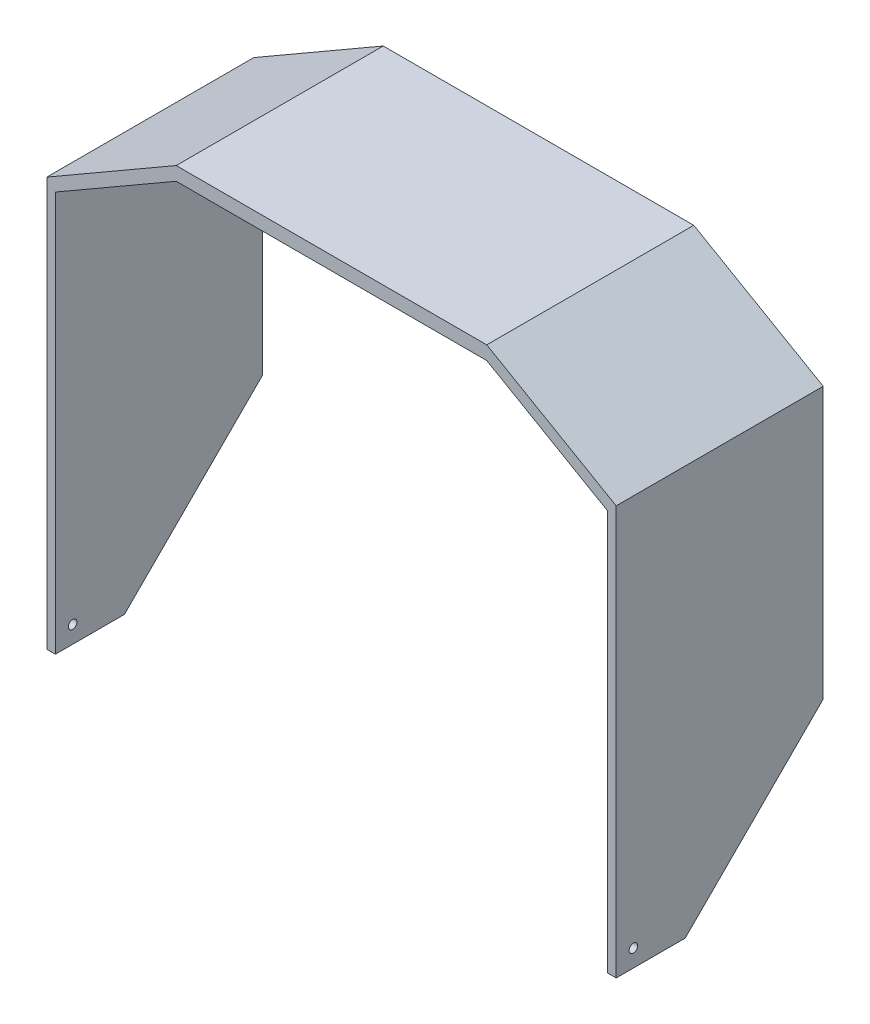
ISO-10303-21;
HEADER;
FILE_DESCRIPTION(('STEP AP214'),'2;1');
FILE_NAME('part.step','',(''),(''),'','','');
FILE_SCHEMA(('AUTOMOTIVE_DESIGN { 1 0 10303 214 1 1 1 1 }'));
ENDSEC;
DATA;
#1=APPLICATION_CONTEXT('core data for automotive mechanical design processes');
#2=APPLICATION_PROTOCOL_DEFINITION('international standard','automotive_design',2000,#1);
#3=PRODUCT_CONTEXT('',#1,'mechanical');
#4=PRODUCT('Part','Part','',(#3));
#5=PRODUCT_RELATED_PRODUCT_CATEGORY('part','',(#4));
#6=PRODUCT_DEFINITION_FORMATION('','',#4);
#7=PRODUCT_DEFINITION_CONTEXT('part definition',#1,'design');
#8=PRODUCT_DEFINITION('design','',#6,#7);
#9=PRODUCT_DEFINITION_SHAPE('','',#8);
#10=(LENGTH_UNIT() NAMED_UNIT(*) SI_UNIT(.MILLI.,.METRE.));
#11=(NAMED_UNIT(*) PLANE_ANGLE_UNIT() SI_UNIT($,.RADIAN.));
#12=(NAMED_UNIT(*) SI_UNIT($,.STERADIAN.) SOLID_ANGLE_UNIT());
#13=UNCERTAINTY_MEASURE_WITH_UNIT(LENGTH_MEASURE(1.E-05),#10,'distance_accuracy_value','');
#14=(GEOMETRIC_REPRESENTATION_CONTEXT(3) GLOBAL_UNCERTAINTY_ASSIGNED_CONTEXT((#13)) GLOBAL_UNIT_ASSIGNED_CONTEXT((#10,
#11,#12)) REPRESENTATION_CONTEXT('',''));
#15=CARTESIAN_POINT('',(0.,0.,0.));
#16=DIRECTION('',(0.,0.,1.));
#17=DIRECTION('',(1.,0.,0.));
#18=AXIS2_PLACEMENT_3D('',#15,#16,#17);
#19=CARTESIAN_POINT('',(0.,0.,120.));
#20=DIRECTION('',(-0.499999999999992,0.866025403784443,0.));
#21=DIRECTION('',(-0.866025403784443,-0.499999999999992,0.));
#22=AXIS2_PLACEMENT_3D('',#19,#20,#21);
#23=PLANE('',#22);
#24=DIRECTION('',(0.866025403784443,0.499999999999992,0.));
#25=VECTOR('',#24,1.);
#26=CARTESIAN_POINT('',(0.,0.,0.));
#27=LINE('',#26,#25);
#28=CARTESIAN_POINT('',(0.,0.,0.));
#29=VERTEX_POINT('',#28);
#30=CARTESIAN_POINT('',(70.0000000000003,40.4145188432731,0.));
#31=VERTEX_POINT('',#30);
#32=EDGE_CURVE('E218',#29,#31,#27,.T.);
#33=ORIENTED_EDGE('',*,*,#32,.T.);
#34=DIRECTION('',(0.,0.,-1.));
#35=VECTOR('',#34,1.);
#36=CARTESIAN_POINT('',(70.0000000000003,40.4145188432731,120.));
#37=LINE('',#36,#35);
#38=CARTESIAN_POINT('',(70.0000000000003,40.4145188432731,120.));
#39=VERTEX_POINT('',#38);
#40=EDGE_CURVE('E48',#39,#31,#37,.T.);
#41=ORIENTED_EDGE('',*,*,#40,.F.);
#42=DIRECTION('',(0.866025403784443,0.499999999999992,0.));
#43=VECTOR('',#42,1.);
#44=CARTESIAN_POINT('',(0.,0.,120.));
#45=LINE('',#44,#43);
#46=CARTESIAN_POINT('',(0.,0.,120.));
#47=VERTEX_POINT('',#46);
#48=EDGE_CURVE('E258',#47,#39,#45,.T.);
#49=ORIENTED_EDGE('',*,*,#48,.F.);
#50=DIRECTION('',(0.,0.,-1.));
#51=VECTOR('',#50,1.);
#52=CARTESIAN_POINT('',(0.,0.,120.));
#53=LINE('',#52,#51);
#54=EDGE_CURVE('E173',#47,#29,#53,.T.);
#55=ORIENTED_EDGE('',*,*,#54,.T.);
#56=EDGE_LOOP('',(#33,#41,#49,#55));
#57=FACE_BOUND('',#56,.T.);
#58=ADVANCED_FACE('F39',(#57),#23,.F.);
#59=CARTESIAN_POINT('',(70.0000000000003,40.4145188432731,120.));
#60=DIRECTION('',(0.,1.,0.));
#61=DIRECTION('',(0.,0.,1.));
#62=AXIS2_PLACEMENT_3D('',#59,#60,#61);
#63=PLANE('',#62);
#64=DIRECTION('',(1.,0.,0.));
#65=VECTOR('',#64,1.);
#66=CARTESIAN_POINT('',(70.0000000000003,40.4145188432731,0.));
#67=LINE('',#66,#65);
#68=CARTESIAN_POINT('',(250.,40.4145188432731,0.));
#69=VERTEX_POINT('',#68);
#70=EDGE_CURVE('E211',#31,#69,#67,.T.);
#71=ORIENTED_EDGE('',*,*,#70,.T.);
#72=DIRECTION('',(0.,0.,-1.));
#73=VECTOR('',#72,1.);
#74=CARTESIAN_POINT('',(250.,40.4145188432731,120.));
#75=LINE('',#74,#73);
#76=CARTESIAN_POINT('',(250.,40.4145188432731,120.));
#77=VERTEX_POINT('',#76);
#78=EDGE_CURVE('E200',#77,#69,#75,.T.);
#79=ORIENTED_EDGE('',*,*,#78,.F.);
#80=DIRECTION('',(1.,0.,0.));
#81=VECTOR('',#80,1.);
#82=CARTESIAN_POINT('',(70.0000000000003,40.4145188432731,120.));
#83=LINE('',#82,#81);
#84=EDGE_CURVE('E212',#39,#77,#83,.T.);
#85=ORIENTED_EDGE('',*,*,#84,.F.);
#86=ORIENTED_EDGE('',*,*,#40,.T.);
#87=EDGE_LOOP('',(#71,#79,#85,#86));
#88=FACE_BOUND('',#87,.T.);
#89=ADVANCED_FACE('F209',(#88),#63,.F.);
#90=CARTESIAN_POINT('',(250.,40.4145188432731,120.));
#91=DIRECTION('',(0.499999999999998,0.86602540378444,0.));
#92=DIRECTION('',(-0.86602540378444,0.499999999999998,0.));
#93=AXIS2_PLACEMENT_3D('',#90,#91,#92);
#94=PLANE('',#93);
#95=DIRECTION('',(0.86602540378444,-0.499999999999998,0.));
#96=VECTOR('',#95,1.);
#97=CARTESIAN_POINT('',(250.,40.4145188432731,0.));
#98=LINE('',#97,#96);
#99=CARTESIAN_POINT('',(320.,-4.5102810375397E-13,0.));
#100=VERTEX_POINT('',#99);
#101=EDGE_CURVE('E227',#69,#100,#98,.T.);
#102=ORIENTED_EDGE('',*,*,#101,.T.);
#103=DIRECTION('',(0.,0.,-1.));
#104=VECTOR('',#103,1.);
#105=CARTESIAN_POINT('',(320.,-4.5102810375397E-13,120.));
#106=LINE('',#105,#104);
#107=CARTESIAN_POINT('',(320.,-4.5102810375397E-13,120.));
#108=VERTEX_POINT('',#107);
#109=EDGE_CURVE('E196',#108,#100,#106,.T.);
#110=ORIENTED_EDGE('',*,*,#109,.F.);
#111=DIRECTION('',(0.86602540378444,-0.499999999999998,0.));
#112=VECTOR('',#111,1.);
#113=CARTESIAN_POINT('',(250.,40.4145188432731,120.));
#114=LINE('',#113,#112);
#115=EDGE_CURVE('E286',#77,#108,#114,.T.);
#116=ORIENTED_EDGE('',*,*,#115,.F.);
#117=ORIENTED_EDGE('',*,*,#78,.T.);
#118=EDGE_LOOP('',(#102,#110,#116,#117));
#119=FACE_BOUND('',#118,.T.);
#120=ADVANCED_FACE('F329',(#119),#94,.F.);
#121=CARTESIAN_POINT('',(320.,-4.5102810375397E-13,120.));
#122=DIRECTION('',(1.,0.,0.));
#123=DIRECTION('',(0.,0.,-1.));
#124=AXIS2_PLACEMENT_3D('',#121,#122,#123);
#125=PLANE('',#124);
#126=CARTESIAN_POINT('',(320.,-222.,110.));
#127=DIRECTION('',(1.,0.,0.));
#128=DIRECTION('',(0.,0.,-1.));
#129=AXIS2_PLACEMENT_3D('',#126,#127,#128);
#130=CIRCLE('',#129,2.50000000000001);
#131=CARTESIAN_POINT('',(320.,-222.,107.5));
#132=VERTEX_POINT('',#131);
#133=EDGE_CURVE('E223',#132,#132,#130,.T.);
#134=ORIENTED_EDGE('',*,*,#133,.T.);
#135=EDGE_LOOP('',(#134));
#136=FACE_BOUND('',#135,.T.);
#137=DIRECTION('',(0.,-1.,0.));
#138=VECTOR('',#137,1.);
#139=CARTESIAN_POINT('',(320.,-4.5102810375397E-13,0.));
#140=LINE('',#139,#138);
#141=CARTESIAN_POINT('',(320.,-152.,0.));
#142=VERTEX_POINT('',#141);
#143=EDGE_CURVE('E238',#100,#142,#140,.T.);
#144=ORIENTED_EDGE('',*,*,#143,.T.);
#145=DIRECTION('',(0.,-0.707106781186547,0.707106781186548));
#146=VECTOR('',#145,1.);
#147=CARTESIAN_POINT('',(320.,-136.,-15.9999999999998));
#148=LINE('',#147,#146);
#149=CARTESIAN_POINT('',(320.,-232.,80.));
#150=VERTEX_POINT('',#149);
#151=EDGE_CURVE('E54',#142,#150,#148,.T.);
#152=ORIENTED_EDGE('',*,*,#151,.T.);
#153=DIRECTION('',(0.,0.,-1.));
#154=VECTOR('',#153,1.);
#155=CARTESIAN_POINT('',(320.,-232.,120.));
#156=LINE('',#155,#154);
#157=CARTESIAN_POINT('',(320.,-232.,120.));
#158=VERTEX_POINT('',#157);
#159=EDGE_CURVE('E192',#158,#150,#156,.T.);
#160=ORIENTED_EDGE('',*,*,#159,.F.);
#161=DIRECTION('',(0.,-1.,0.));
#162=VECTOR('',#161,1.);
#163=CARTESIAN_POINT('',(320.,-4.5102810375397E-13,120.));
#164=LINE('',#163,#162);
#165=EDGE_CURVE('E283',#108,#158,#164,.T.);
#166=ORIENTED_EDGE('',*,*,#165,.F.);
#167=ORIENTED_EDGE('',*,*,#109,.T.);
#168=EDGE_LOOP('',(#144,#152,#160,#166,#167));
#169=FACE_BOUND('',#168,.T.);
#170=ADVANCED_FACE('F334',(#136,#169),#125,.F.);
#171=CARTESIAN_POINT('',(325.,-232.,120.));
#172=DIRECTION('',(0.,1.,0.));
#173=DIRECTION('',(0.,0.,1.));
#174=AXIS2_PLACEMENT_3D('',#171,#172,#173);
#175=PLANE('',#174);
#176=ORIENTED_EDGE('',*,*,#159,.T.);
#177=DIRECTION('',(1.,0.,0.));
#178=VECTOR('',#177,1.);
#179=CARTESIAN_POINT('',(-5.,-232.,80.));
#180=LINE('',#179,#178);
#181=CARTESIAN_POINT('',(325.,-232.,80.));
#182=VERTEX_POINT('',#181);
#183=EDGE_CURVE('E148',#150,#182,#180,.T.);
#184=ORIENTED_EDGE('',*,*,#183,.T.);
#185=DIRECTION('',(0.,0.,-1.));
#186=VECTOR('',#185,1.);
#187=CARTESIAN_POINT('',(325.,-232.,120.));
#188=LINE('',#187,#186);
#189=CARTESIAN_POINT('',(325.,-232.,120.));
#190=VERTEX_POINT('',#189);
#191=EDGE_CURVE('E188',#190,#182,#188,.T.);
#192=ORIENTED_EDGE('',*,*,#191,.F.);
#193=DIRECTION('',(1.,0.,0.));
#194=VECTOR('',#193,1.);
#195=CARTESIAN_POINT('',(325.,-232.,120.));
#196=LINE('',#195,#194);
#197=EDGE_CURVE('E280',#158,#190,#196,.T.);
#198=ORIENTED_EDGE('',*,*,#197,.F.);
#199=EDGE_LOOP('',(#176,#184,#192,#198));
#200=FACE_BOUND('',#199,.T.);
#201=ADVANCED_FACE('F341',(#200),#175,.F.);
#202=CARTESIAN_POINT('',(325.,4.99999999999954,120.));
#203=DIRECTION('',(-1.,0.,0.));
#204=DIRECTION('',(0.,0.,1.));
#205=AXIS2_PLACEMENT_3D('',#202,#203,#204);
#206=PLANE('',#205);
#207=CARTESIAN_POINT('',(325.,-222.,110.));
#208=DIRECTION('',(-1.,0.,0.));
#209=DIRECTION('',(0.,0.,1.));
#210=AXIS2_PLACEMENT_3D('',#207,#208,#209);
#211=CIRCLE('',#210,2.50000000000001);
#212=CARTESIAN_POINT('',(325.,-222.,112.5));
#213=VERTEX_POINT('',#212);
#214=EDGE_CURVE('E230',#213,#213,#211,.T.);
#215=ORIENTED_EDGE('',*,*,#214,.T.);
#216=EDGE_LOOP('',(#215));
#217=FACE_BOUND('',#216,.T.);
#218=ORIENTED_EDGE('',*,*,#191,.T.);
#219=DIRECTION('',(0.,0.707106781186547,-0.707106781186548));
#220=VECTOR('',#219,1.);
#221=CARTESIAN_POINT('',(325.,-133.5,-18.4999999999998));
#222=LINE('',#221,#220);
#223=CARTESIAN_POINT('',(325.,-152.,0.));
#224=VERTEX_POINT('',#223);
#225=EDGE_CURVE('E298',#182,#224,#222,.T.);
#226=ORIENTED_EDGE('',*,*,#225,.T.);
#227=DIRECTION('',(0.,1.,0.));
#228=VECTOR('',#227,1.);
#229=CARTESIAN_POINT('',(325.,4.99999999999954,0.));
#230=LINE('',#229,#228);
#231=CARTESIAN_POINT('',(325.,4.99999999999954,0.));
#232=VERTEX_POINT('',#231);
#233=EDGE_CURVE('E242',#224,#232,#230,.T.);
#234=ORIENTED_EDGE('',*,*,#233,.T.);
#235=DIRECTION('',(0.,0.,-1.));
#236=VECTOR('',#235,1.);
#237=CARTESIAN_POINT('',(325.,4.99999999999954,120.));
#238=LINE('',#237,#236);
#239=CARTESIAN_POINT('',(325.,4.99999999999954,120.));
#240=VERTEX_POINT('',#239);
#241=EDGE_CURVE('E184',#240,#232,#238,.T.);
#242=ORIENTED_EDGE('',*,*,#241,.F.);
#243=DIRECTION('',(0.,1.,0.));
#244=VECTOR('',#243,1.);
#245=CARTESIAN_POINT('',(325.,4.99999999999954,120.));
#246=LINE('',#245,#244);
#247=EDGE_CURVE('E277',#190,#240,#246,.T.);
#248=ORIENTED_EDGE('',*,*,#247,.F.);
#249=EDGE_LOOP('',(#218,#226,#234,#242,#248));
#250=FACE_BOUND('',#249,.T.);
#251=ADVANCED_FACE('F343',(#217,#250),#206,.F.);
#252=CARTESIAN_POINT('',(325.,4.99999999999954,120.));
#253=DIRECTION('',(-0.500000000000004,-0.866025403784436,0.));
#254=DIRECTION('',(0.866025403784436,-0.500000000000004,0.));
#255=AXIS2_PLACEMENT_3D('',#252,#253,#254);
#256=PLANE('',#255);
#257=DIRECTION('',(-0.866025403784436,0.500000000000004,0.));
#258=VECTOR('',#257,1.);
#259=CARTESIAN_POINT('',(325.,4.99999999999954,0.));
#260=LINE('',#259,#258);
#261=CARTESIAN_POINT('',(250.,48.3012701892219,0.));
#262=VERTEX_POINT('',#261);
#263=EDGE_CURVE('E245',#232,#262,#260,.T.);
#264=ORIENTED_EDGE('',*,*,#263,.T.);
#265=DIRECTION('',(0.,0.,-1.));
#266=VECTOR('',#265,1.);
#267=CARTESIAN_POINT('',(250.,48.3012701892219,120.));
#268=LINE('',#267,#266);
#269=CARTESIAN_POINT('',(250.,48.3012701892219,120.));
#270=VERTEX_POINT('',#269);
#271=EDGE_CURVE('E180',#270,#262,#268,.T.);
#272=ORIENTED_EDGE('',*,*,#271,.F.);
#273=DIRECTION('',(-0.866025403784436,0.500000000000004,0.));
#274=VECTOR('',#273,1.);
#275=CARTESIAN_POINT('',(325.,4.99999999999954,120.));
#276=LINE('',#275,#274);
#277=EDGE_CURVE('E274',#240,#270,#276,.T.);
#278=ORIENTED_EDGE('',*,*,#277,.F.);
#279=ORIENTED_EDGE('',*,*,#241,.T.);
#280=EDGE_LOOP('',(#264,#272,#278,#279));
#281=FACE_BOUND('',#280,.T.);
#282=ADVANCED_FACE('F349',(#281),#256,.F.);
#283=CARTESIAN_POINT('',(250.,48.3012701892219,120.));
#284=DIRECTION('',(0.,-1.,0.));
#285=DIRECTION('',(1.,0.,0.));
#286=AXIS2_PLACEMENT_3D('',#283,#284,#285);
#287=PLANE('',#286);
#288=DIRECTION('',(-1.,0.,0.));
#289=VECTOR('',#288,1.);
#290=CARTESIAN_POINT('',(250.,48.3012701892219,0.));
#291=LINE('',#290,#289);
#292=CARTESIAN_POINT('',(70.0000000000003,48.3012701892219,0.));
#293=VERTEX_POINT('',#292);
#294=EDGE_CURVE('E248',#262,#293,#291,.T.);
#295=ORIENTED_EDGE('',*,*,#294,.T.);
#296=DIRECTION('',(0.,0.,-1.));
#297=VECTOR('',#296,1.);
#298=CARTESIAN_POINT('',(70.0000000000003,48.3012701892219,120.));
#299=LINE('',#298,#297);
#300=CARTESIAN_POINT('',(70.0000000000003,48.3012701892219,120.));
#301=VERTEX_POINT('',#300);
#302=EDGE_CURVE('E171',#301,#293,#299,.T.);
#303=ORIENTED_EDGE('',*,*,#302,.F.);
#304=DIRECTION('',(-1.,0.,0.));
#305=VECTOR('',#304,1.);
#306=CARTESIAN_POINT('',(250.,48.3012701892219,120.));
#307=LINE('',#306,#305);
#308=EDGE_CURVE('E271',#270,#301,#307,.T.);
#309=ORIENTED_EDGE('',*,*,#308,.F.);
#310=ORIENTED_EDGE('',*,*,#271,.T.);
#311=EDGE_LOOP('',(#295,#303,#309,#310));
#312=FACE_BOUND('',#311,.T.);
#313=ADVANCED_FACE('F355',(#312),#287,.F.);
#314=CARTESIAN_POINT('',(70.0000000000003,48.3012701892219,120.));
#315=DIRECTION('',(0.499999999999998,-0.86602540378444,0.));
#316=DIRECTION('',(0.86602540378444,0.499999999999998,0.));
#317=AXIS2_PLACEMENT_3D('',#314,#315,#316);
#318=PLANE('',#317);
#319=DIRECTION('',(-0.86602540378444,-0.499999999999998,0.));
#320=VECTOR('',#319,1.);
#321=CARTESIAN_POINT('',(70.0000000000003,48.3012701892219,0.));
#322=LINE('',#321,#320);
#323=CARTESIAN_POINT('',(-5.,5.,0.));
#324=VERTEX_POINT('',#323);
#325=EDGE_CURVE('E251',#293,#324,#322,.T.);
#326=ORIENTED_EDGE('',*,*,#325,.T.);
#327=DIRECTION('',(0.,0.,-1.));
#328=VECTOR('',#327,1.);
#329=CARTESIAN_POINT('',(-5.,5.,120.));
#330=LINE('',#329,#328);
#331=CARTESIAN_POINT('',(-5.,5.,120.));
#332=VERTEX_POINT('',#331);
#333=EDGE_CURVE('E166',#332,#324,#330,.T.);
#334=ORIENTED_EDGE('',*,*,#333,.F.);
#335=DIRECTION('',(-0.86602540378444,-0.499999999999998,0.));
#336=VECTOR('',#335,1.);
#337=CARTESIAN_POINT('',(70.0000000000003,48.3012701892219,120.));
#338=LINE('',#337,#336);
#339=EDGE_CURVE('E266',#301,#332,#338,.T.);
#340=ORIENTED_EDGE('',*,*,#339,.F.);
#341=ORIENTED_EDGE('',*,*,#302,.T.);
#342=EDGE_LOOP('',(#326,#334,#340,#341));
#343=FACE_BOUND('',#342,.T.);
#344=ADVANCED_FACE('F359',(#343),#318,.F.);
#345=CARTESIAN_POINT('',(-5.,5.,120.));
#346=DIRECTION('',(1.,0.,0.));
#347=DIRECTION('',(0.,0.,-1.));
#348=AXIS2_PLACEMENT_3D('',#345,#346,#347);
#349=PLANE('',#348);
#350=CARTESIAN_POINT('',(-5.,-222.,110.));
#351=DIRECTION('',(1.,0.,0.));
#352=DIRECTION('',(0.,0.,-1.));
#353=AXIS2_PLACEMENT_3D('',#350,#351,#352);
#354=CIRCLE('',#353,2.50000000000001);
#355=CARTESIAN_POINT('',(-5.,-222.,107.5));
#356=VERTEX_POINT('',#355);
#357=EDGE_CURVE('E147',#356,#356,#354,.T.);
#358=ORIENTED_EDGE('',*,*,#357,.T.);
#359=EDGE_LOOP('',(#358));
#360=FACE_BOUND('',#359,.T.);
#361=DIRECTION('',(0.,-1.,0.));
#362=VECTOR('',#361,1.);
#363=CARTESIAN_POINT('',(-5.,5.,0.));
#364=LINE('',#363,#362);
#365=CARTESIAN_POINT('',(-5.,-152.,0.));
#366=VERTEX_POINT('',#365);
#367=EDGE_CURVE('E159',#324,#366,#364,.T.);
#368=ORIENTED_EDGE('',*,*,#367,.T.);
#369=DIRECTION('',(0.,-0.707106781186547,0.707106781186548));
#370=VECTOR('',#369,1.);
#371=CARTESIAN_POINT('',(-5.,-232.,80.));
#372=LINE('',#371,#370);
#373=CARTESIAN_POINT('',(-5.,-232.,80.));
#374=VERTEX_POINT('',#373);
#375=EDGE_CURVE('E62',#366,#374,#372,.T.);
#376=ORIENTED_EDGE('',*,*,#375,.T.);
#377=DIRECTION('',(0.,0.,-1.));
#378=VECTOR('',#377,1.);
#379=CARTESIAN_POINT('',(-5.,-232.,120.));
#380=LINE('',#379,#378);
#381=CARTESIAN_POINT('',(-5.,-232.,120.));
#382=VERTEX_POINT('',#381);
#383=EDGE_CURVE('E155',#382,#374,#380,.T.);
#384=ORIENTED_EDGE('',*,*,#383,.F.);
#385=DIRECTION('',(0.,-1.,0.));
#386=VECTOR('',#385,1.);
#387=CARTESIAN_POINT('',(-5.,5.,120.));
#388=LINE('',#387,#386);
#389=EDGE_CURVE('E264',#332,#382,#388,.T.);
#390=ORIENTED_EDGE('',*,*,#389,.F.);
#391=ORIENTED_EDGE('',*,*,#333,.T.);
#392=EDGE_LOOP('',(#368,#376,#384,#390,#391));
#393=FACE_BOUND('',#392,.T.);
#394=ADVANCED_FACE('F153',(#360,#393),#349,.F.);
#395=CARTESIAN_POINT('',(0.,-232.,120.));
#396=DIRECTION('',(0.,1.,0.));
#397=DIRECTION('',(0.,0.,1.));
#398=AXIS2_PLACEMENT_3D('',#395,#396,#397);
#399=PLANE('',#398);
#400=ORIENTED_EDGE('',*,*,#383,.T.);
#401=CARTESIAN_POINT('',(0.,-232.,80.));
#402=VERTEX_POINT('',#401);
#403=EDGE_CURVE('E138',#374,#402,#180,.T.);
#404=ORIENTED_EDGE('',*,*,#403,.T.);
#405=DIRECTION('',(0.,0.,-1.));
#406=VECTOR('',#405,1.);
#407=CARTESIAN_POINT('',(0.,-232.,120.));
#408=LINE('',#407,#406);
#409=CARTESIAN_POINT('',(0.,-232.,120.));
#410=VERTEX_POINT('',#409);
#411=EDGE_CURVE('E167',#410,#402,#408,.T.);
#412=ORIENTED_EDGE('',*,*,#411,.F.);
#413=DIRECTION('',(1.,0.,0.));
#414=VECTOR('',#413,1.);
#415=CARTESIAN_POINT('',(0.,-232.,120.));
#416=LINE('',#415,#414);
#417=EDGE_CURVE('E164',#382,#410,#416,.T.);
#418=ORIENTED_EDGE('',*,*,#417,.F.);
#419=EDGE_LOOP('',(#400,#404,#412,#418));
#420=FACE_BOUND('',#419,.T.);
#421=ADVANCED_FACE('F163',(#420),#399,.F.);
#422=CARTESIAN_POINT('',(0.,0.,120.));
#423=DIRECTION('',(-1.,0.,0.));
#424=DIRECTION('',(0.,0.,1.));
#425=AXIS2_PLACEMENT_3D('',#422,#423,#424);
#426=PLANE('',#425);
#427=CARTESIAN_POINT('',(0.,-222.,110.));
#428=DIRECTION('',(-1.,0.,0.));
#429=DIRECTION('',(0.,0.,1.));
#430=AXIS2_PLACEMENT_3D('',#427,#428,#429);
#431=CIRCLE('',#430,2.50000000000001);
#432=CARTESIAN_POINT('',(0.,-222.,112.5));
#433=VERTEX_POINT('',#432);
#434=EDGE_CURVE('E42',#433,#433,#431,.T.);
#435=ORIENTED_EDGE('',*,*,#434,.T.);
#436=EDGE_LOOP('',(#435));
#437=FACE_BOUND('',#436,.T.);
#438=ORIENTED_EDGE('',*,*,#411,.T.);
#439=DIRECTION('',(0.,0.707106781186547,-0.707106781186548));
#440=VECTOR('',#439,1.);
#441=CARTESIAN_POINT('',(0.,-136.,-16.));
#442=LINE('',#441,#440);
#443=CARTESIAN_POINT('',(0.,-152.,0.));
#444=VERTEX_POINT('',#443);
#445=EDGE_CURVE('E141',#402,#444,#442,.T.);
#446=ORIENTED_EDGE('',*,*,#445,.T.);
#447=DIRECTION('',(0.,1.,0.));
#448=VECTOR('',#447,1.);
#449=CARTESIAN_POINT('',(0.,0.,0.));
#450=LINE('',#449,#448);
#451=EDGE_CURVE('E256',#444,#29,#450,.T.);
#452=ORIENTED_EDGE('',*,*,#451,.T.);
#453=ORIENTED_EDGE('',*,*,#54,.F.);
#454=DIRECTION('',(0.,1.,0.));
#455=VECTOR('',#454,1.);
#456=CARTESIAN_POINT('',(0.,0.,120.));
#457=LINE('',#456,#455);
#458=EDGE_CURVE('E233',#410,#47,#457,.T.);
#459=ORIENTED_EDGE('',*,*,#458,.F.);
#460=EDGE_LOOP('',(#438,#446,#452,#453,#459));
#461=FACE_BOUND('',#460,.T.);
#462=ADVANCED_FACE('F320',(#437,#461),#426,.F.);
#463=CARTESIAN_POINT('',(0.,0.,120.));
#464=DIRECTION('',(0.,0.,-1.));
#465=DIRECTION('',(-1.,0.,0.));
#466=AXIS2_PLACEMENT_3D('',#463,#464,#465);
#467=PLANE('',#466);
#468=ORIENTED_EDGE('',*,*,#48,.T.);
#469=ORIENTED_EDGE('',*,*,#84,.T.);
#470=ORIENTED_EDGE('',*,*,#115,.T.);
#471=ORIENTED_EDGE('',*,*,#165,.T.);
#472=ORIENTED_EDGE('',*,*,#197,.T.);
#473=ORIENTED_EDGE('',*,*,#247,.T.);
#474=ORIENTED_EDGE('',*,*,#277,.T.);
#475=ORIENTED_EDGE('',*,*,#308,.T.);
#476=ORIENTED_EDGE('',*,*,#339,.T.);
#477=ORIENTED_EDGE('',*,*,#389,.T.);
#478=ORIENTED_EDGE('',*,*,#417,.T.);
#479=ORIENTED_EDGE('',*,*,#458,.T.);
#480=EDGE_LOOP('',(#468,#469,#470,#471,#472,#473,#474,#475,#476,#477,#478,#479));
#481=FACE_BOUND('',#480,.T.);
#482=ADVANCED_FACE('F323',(#481),#467,.F.);
#483=CARTESIAN_POINT('',(0.,0.,0.));
#484=DIRECTION('',(0.,0.,-1.));
#485=DIRECTION('',(-1.,0.,0.));
#486=AXIS2_PLACEMENT_3D('',#483,#484,#485);
#487=PLANE('',#486);
#488=DIRECTION('',(1.,0.,0.));
#489=VECTOR('',#488,1.);
#490=CARTESIAN_POINT('',(-5.,-152.,0.));
#491=LINE('',#490,#489);
#492=EDGE_CURVE('E161',#366,#444,#491,.T.);
#493=ORIENTED_EDGE('',*,*,#492,.F.);
#494=ORIENTED_EDGE('',*,*,#367,.F.);
#495=ORIENTED_EDGE('',*,*,#325,.F.);
#496=ORIENTED_EDGE('',*,*,#294,.F.);
#497=ORIENTED_EDGE('',*,*,#263,.F.);
#498=ORIENTED_EDGE('',*,*,#233,.F.);
#499=DIRECTION('',(1.,0.,0.));
#500=VECTOR('',#499,1.);
#501=CARTESIAN_POINT('',(0.,-152.,0.));
#502=LINE('',#501,#500);
#503=EDGE_CURVE('E11',#142,#224,#502,.T.);
#504=ORIENTED_EDGE('',*,*,#503,.F.);
#505=ORIENTED_EDGE('',*,*,#143,.F.);
#506=ORIENTED_EDGE('',*,*,#101,.F.);
#507=ORIENTED_EDGE('',*,*,#70,.F.);
#508=ORIENTED_EDGE('',*,*,#32,.F.);
#509=ORIENTED_EDGE('',*,*,#451,.F.);
#510=EDGE_LOOP('',(#493,#494,#495,#496,#497,#498,#504,#505,#506,#507,#508,#509));
#511=FACE_BOUND('',#510,.T.);
#512=ADVANCED_FACE('F360',(#511),#487,.T.);
#513=CARTESIAN_POINT('',(-5.,-232.,80.));
#514=DIRECTION('',(0.,0.707106781186548,0.707106781186547));
#515=DIRECTION('',(0.,-0.707106781186547,0.707106781186548));
#516=AXIS2_PLACEMENT_3D('',#513,#514,#515);
#517=PLANE('',#516);
#518=ORIENTED_EDGE('',*,*,#503,.T.);
#519=ORIENTED_EDGE('',*,*,#225,.F.);
#520=ORIENTED_EDGE('',*,*,#183,.F.);
#521=ORIENTED_EDGE('',*,*,#151,.F.);
#522=EDGE_LOOP('',(#518,#519,#520,#521));
#523=FACE_BOUND('',#522,.T.);
#524=ADVANCED_FACE('F361',(#523),#517,.F.);
#525=ORIENTED_EDGE('',*,*,#403,.F.);
#526=ORIENTED_EDGE('',*,*,#375,.F.);
#527=ORIENTED_EDGE('',*,*,#492,.T.);
#528=ORIENTED_EDGE('',*,*,#445,.F.);
#529=EDGE_LOOP('',(#525,#526,#527,#528));
#530=FACE_BOUND('',#529,.T.);
#531=ADVANCED_FACE('F139',(#530),#517,.F.);
#532=CARTESIAN_POINT('',(-5.,-222.,110.));
#533=DIRECTION('',(1.,0.,0.));
#534=DIRECTION('',(0.,0.,-1.));
#535=AXIS2_PLACEMENT_3D('',#532,#533,#534);
#536=CYLINDRICAL_SURFACE('',#535,2.50000000000001);
#537=ORIENTED_EDGE('',*,*,#357,.F.);
#538=EDGE_LOOP('',(#537));
#539=FACE_BOUND('',#538,.T.);
#540=ORIENTED_EDGE('',*,*,#434,.F.);
#541=EDGE_LOOP('',(#540));
#542=FACE_BOUND('',#541,.T.);
#543=ADVANCED_FACE('F311',(#539,#542),#536,.F.);
#544=ORIENTED_EDGE('',*,*,#214,.F.);
#545=EDGE_LOOP('',(#544));
#546=FACE_BOUND('',#545,.T.);
#547=ORIENTED_EDGE('',*,*,#133,.F.);
#548=EDGE_LOOP('',(#547));
#549=FACE_BOUND('',#548,.T.);
#550=ADVANCED_FACE('F314',(#546,#549),#536,.F.);
#551=CLOSED_SHELL('',(#58,#89,#120,#170,#201,#251,#282,#313,#344,#394,#421,#462,#482,#512,#524,
#531,#543,#550));
#552=MANIFOLD_SOLID_BREP('B2',#551);
#553=ADVANCED_BREP_SHAPE_REPRESENTATION('',(#18,#552),#14);
#554=SHAPE_DEFINITION_REPRESENTATION(#9,#553);
ENDSEC;
END-ISO-10303-21;
